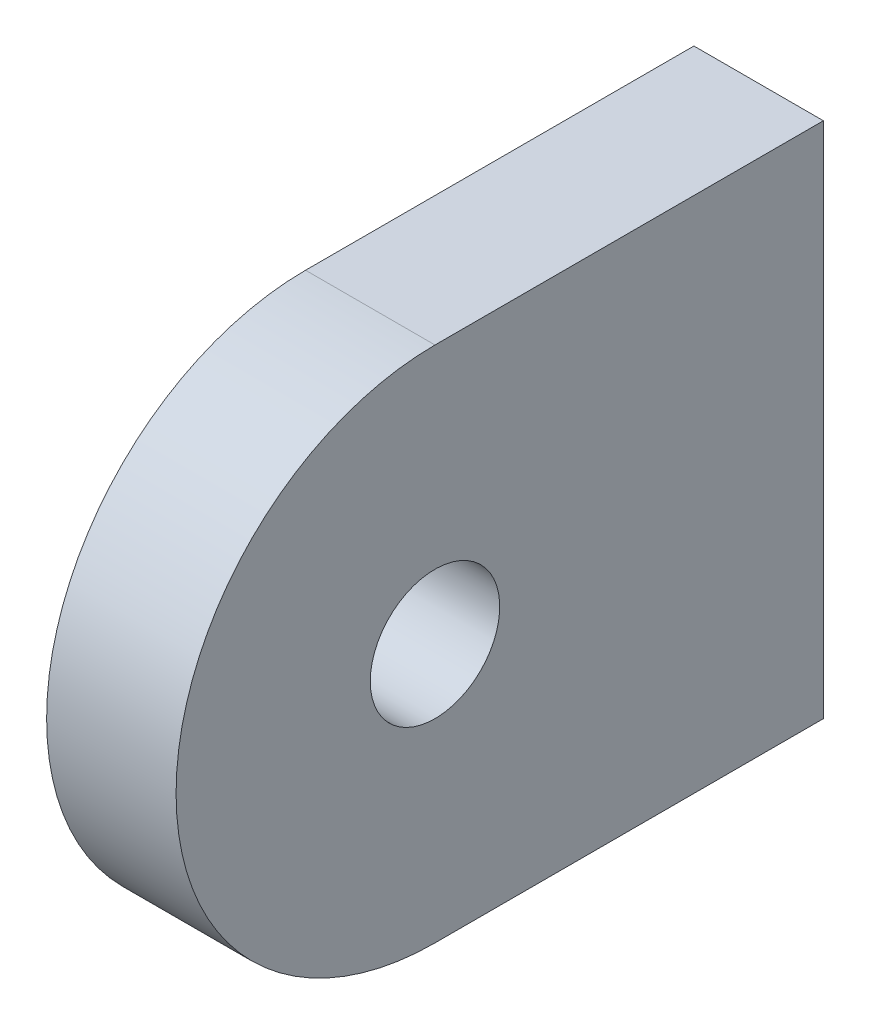
ISO-10303-21;
HEADER;
FILE_DESCRIPTION(('STEP AP214'),'2;1');
FILE_NAME('part.step','',(''),(''),'','','');
FILE_SCHEMA(('AUTOMOTIVE_DESIGN { 1 0 10303 214 1 1 1 1 }'));
ENDSEC;
DATA;
#1=APPLICATION_CONTEXT('core data for automotive mechanical design processes');
#2=APPLICATION_PROTOCOL_DEFINITION('international standard','automotive_design',2000,#1);
#3=PRODUCT_CONTEXT('',#1,'mechanical');
#4=PRODUCT('Part','Part','',(#3));
#5=PRODUCT_RELATED_PRODUCT_CATEGORY('part','',(#4));
#6=PRODUCT_DEFINITION_FORMATION('','',#4);
#7=PRODUCT_DEFINITION_CONTEXT('part definition',#1,'design');
#8=PRODUCT_DEFINITION('design','',#6,#7);
#9=PRODUCT_DEFINITION_SHAPE('','',#8);
#10=(LENGTH_UNIT() NAMED_UNIT(*) SI_UNIT(.MILLI.,.METRE.));
#11=(NAMED_UNIT(*) PLANE_ANGLE_UNIT() SI_UNIT($,.RADIAN.));
#12=(NAMED_UNIT(*) SI_UNIT($,.STERADIAN.) SOLID_ANGLE_UNIT());
#13=UNCERTAINTY_MEASURE_WITH_UNIT(LENGTH_MEASURE(1.E-05),#10,'distance_accuracy_value','');
#14=(GEOMETRIC_REPRESENTATION_CONTEXT(3) GLOBAL_UNCERTAINTY_ASSIGNED_CONTEXT((#13)) GLOBAL_UNIT_ASSIGNED_CONTEXT((#10,
#11,#12)) REPRESENTATION_CONTEXT('',''));
#15=CARTESIAN_POINT('',(0.,0.,0.));
#16=DIRECTION('',(0.,0.,1.));
#17=DIRECTION('',(1.,0.,0.));
#18=AXIS2_PLACEMENT_3D('',#15,#16,#17);
#19=CARTESIAN_POINT('',(-13.,-220.,175.));
#20=DIRECTION('',(-1.,0.,0.));
#21=DIRECTION('',(0.,0.,1.));
#22=AXIS2_PLACEMENT_3D('',#19,#20,#21);
#23=PLANE('',#22);
#24=CARTESIAN_POINT('',(-13.,-220.,175.));
#25=DIRECTION('',(-1.,0.,0.));
#26=DIRECTION('',(0.,0.,1.));
#27=AXIS2_PLACEMENT_3D('',#24,#25,#26);
#28=CIRCLE('',#27,20.);
#29=CARTESIAN_POINT('',(-13.,-240.,175.));
#30=VERTEX_POINT('',#29);
#31=CARTESIAN_POINT('',(-13.,-200.,175.));
#32=VERTEX_POINT('',#31);
#33=EDGE_CURVE('E93',#30,#32,#28,.T.);
#34=ORIENTED_EDGE('',*,*,#33,.T.);
#35=DIRECTION('',(0.,0.,-1.));
#36=VECTOR('',#35,1.);
#37=CARTESIAN_POINT('',(-13.,-200.,175.));
#38=LINE('',#37,#36);
#39=CARTESIAN_POINT('',(-13.,-200.,145.));
#40=VERTEX_POINT('',#39);
#41=EDGE_CURVE('E88',#32,#40,#38,.T.);
#42=ORIENTED_EDGE('',*,*,#41,.T.);
#43=DIRECTION('',(0.,-1.,0.));
#44=VECTOR('',#43,1.);
#45=CARTESIAN_POINT('',(-13.,-200.,145.));
#46=LINE('',#45,#44);
#47=CARTESIAN_POINT('',(-13.,-240.,145.));
#48=VERTEX_POINT('',#47);
#49=EDGE_CURVE('E91',#40,#48,#46,.T.);
#50=ORIENTED_EDGE('',*,*,#49,.T.);
#51=DIRECTION('',(0.,0.,1.));
#52=VECTOR('',#51,1.);
#53=CARTESIAN_POINT('',(-13.,-240.,145.));
#54=LINE('',#53,#52);
#55=EDGE_CURVE('E58',#48,#30,#54,.T.);
#56=ORIENTED_EDGE('',*,*,#55,.T.);
#57=EDGE_LOOP('',(#34,#42,#50,#56));
#58=FACE_BOUND('',#57,.T.);
#59=CARTESIAN_POINT('',(-13.,-220.,175.));
#60=DIRECTION('',(-1.,0.,0.));
#61=DIRECTION('',(0.,0.,1.));
#62=AXIS2_PLACEMENT_3D('',#59,#60,#61);
#63=CIRCLE('',#62,5.00000000000002);
#64=CARTESIAN_POINT('',(-13.,-220.,180.));
#65=VERTEX_POINT('',#64);
#66=EDGE_CURVE('E108',#65,#65,#63,.T.);
#67=ORIENTED_EDGE('',*,*,#66,.F.);
#68=EDGE_LOOP('',(#67));
#69=FACE_BOUND('',#68,.T.);
#70=ADVANCED_FACE('F41',(#58,#69),#23,.T.);
#71=CARTESIAN_POINT('',(-3.,-220.,175.));
#72=DIRECTION('',(-1.,0.,0.));
#73=DIRECTION('',(0.,0.,1.));
#74=AXIS2_PLACEMENT_3D('',#71,#72,#73);
#75=PLANE('',#74);
#76=CARTESIAN_POINT('',(-3.,-220.,175.));
#77=DIRECTION('',(-1.,0.,0.));
#78=DIRECTION('',(0.,0.,1.));
#79=AXIS2_PLACEMENT_3D('',#76,#77,#78);
#80=CIRCLE('',#79,20.);
#81=CARTESIAN_POINT('',(-3.,-240.,175.));
#82=VERTEX_POINT('',#81);
#83=CARTESIAN_POINT('',(-3.,-200.,175.));
#84=VERTEX_POINT('',#83);
#85=EDGE_CURVE('E105',#82,#84,#80,.T.);
#86=ORIENTED_EDGE('',*,*,#85,.F.);
#87=DIRECTION('',(0.,0.,1.));
#88=VECTOR('',#87,1.);
#89=CARTESIAN_POINT('',(-3.,-240.,145.));
#90=LINE('',#89,#88);
#91=CARTESIAN_POINT('',(-3.,-240.,145.));
#92=VERTEX_POINT('',#91);
#93=EDGE_CURVE('E81',#92,#82,#90,.T.);
#94=ORIENTED_EDGE('',*,*,#93,.F.);
#95=DIRECTION('',(0.,-1.,0.));
#96=VECTOR('',#95,1.);
#97=CARTESIAN_POINT('',(-3.,-200.,145.));
#98=LINE('',#97,#96);
#99=CARTESIAN_POINT('',(-3.,-200.,145.));
#100=VERTEX_POINT('',#99);
#101=EDGE_CURVE('E75',#100,#92,#98,.T.);
#102=ORIENTED_EDGE('',*,*,#101,.F.);
#103=DIRECTION('',(0.,0.,-1.));
#104=VECTOR('',#103,1.);
#105=CARTESIAN_POINT('',(-3.,-200.,175.));
#106=LINE('',#105,#104);
#107=EDGE_CURVE('E97',#84,#100,#106,.T.);
#108=ORIENTED_EDGE('',*,*,#107,.F.);
#109=EDGE_LOOP('',(#86,#94,#102,#108));
#110=FACE_BOUND('',#109,.T.);
#111=CARTESIAN_POINT('',(-3.,-220.,175.));
#112=DIRECTION('',(-1.,0.,0.));
#113=DIRECTION('',(0.,0.,1.));
#114=AXIS2_PLACEMENT_3D('',#111,#112,#113);
#115=CIRCLE('',#114,5.00000000000002);
#116=CARTESIAN_POINT('',(-3.,-220.,180.));
#117=VERTEX_POINT('',#116);
#118=EDGE_CURVE('E120',#117,#117,#115,.T.);
#119=ORIENTED_EDGE('',*,*,#118,.T.);
#120=EDGE_LOOP('',(#119));
#121=FACE_BOUND('',#120,.T.);
#122=ADVANCED_FACE('F116',(#110,#121),#75,.F.);
#123=CARTESIAN_POINT('',(-13.,-220.,175.));
#124=DIRECTION('',(1.,0.,0.));
#125=DIRECTION('',(0.,0.,-1.));
#126=AXIS2_PLACEMENT_3D('',#123,#124,#125);
#127=CYLINDRICAL_SURFACE('',#126,20.);
#128=ORIENTED_EDGE('',*,*,#85,.T.);
#129=DIRECTION('',(1.,0.,0.));
#130=VECTOR('',#129,1.);
#131=CARTESIAN_POINT('',(-13.,-200.,175.));
#132=LINE('',#131,#130);
#133=EDGE_CURVE('E11',#32,#84,#132,.T.);
#134=ORIENTED_EDGE('',*,*,#133,.F.);
#135=ORIENTED_EDGE('',*,*,#33,.F.);
#136=DIRECTION('',(1.,0.,0.));
#137=VECTOR('',#136,1.);
#138=CARTESIAN_POINT('',(-13.,-240.,175.));
#139=LINE('',#138,#137);
#140=EDGE_CURVE('E101',#30,#82,#139,.T.);
#141=ORIENTED_EDGE('',*,*,#140,.T.);
#142=EDGE_LOOP('',(#128,#134,#135,#141));
#143=FACE_BOUND('',#142,.T.);
#144=ADVANCED_FACE('F43',(#143),#127,.T.);
#145=CARTESIAN_POINT('',(-13.,-200.,175.));
#146=DIRECTION('',(0.,-1.,0.));
#147=DIRECTION('',(0.,0.,-1.));
#148=AXIS2_PLACEMENT_3D('',#145,#146,#147);
#149=PLANE('',#148);
#150=ORIENTED_EDGE('',*,*,#107,.T.);
#151=DIRECTION('',(1.,0.,0.));
#152=VECTOR('',#151,1.);
#153=CARTESIAN_POINT('',(-13.,-200.,145.));
#154=LINE('',#153,#152);
#155=EDGE_CURVE('E50',#40,#100,#154,.T.);
#156=ORIENTED_EDGE('',*,*,#155,.F.);
#157=ORIENTED_EDGE('',*,*,#41,.F.);
#158=ORIENTED_EDGE('',*,*,#133,.T.);
#159=EDGE_LOOP('',(#150,#156,#157,#158));
#160=FACE_BOUND('',#159,.T.);
#161=ADVANCED_FACE('F96',(#160),#149,.F.);
#162=CARTESIAN_POINT('',(-13.,-200.,145.));
#163=DIRECTION('',(0.,0.,1.));
#164=DIRECTION('',(1.,0.,0.));
#165=AXIS2_PLACEMENT_3D('',#162,#163,#164);
#166=PLANE('',#165);
#167=ORIENTED_EDGE('',*,*,#101,.T.);
#168=DIRECTION('',(1.,0.,0.));
#169=VECTOR('',#168,1.);
#170=CARTESIAN_POINT('',(-13.,-240.,145.));
#171=LINE('',#170,#169);
#172=EDGE_CURVE('E98',#48,#92,#171,.T.);
#173=ORIENTED_EDGE('',*,*,#172,.F.);
#174=ORIENTED_EDGE('',*,*,#49,.F.);
#175=ORIENTED_EDGE('',*,*,#155,.T.);
#176=EDGE_LOOP('',(#167,#173,#174,#175));
#177=FACE_BOUND('',#176,.T.);
#178=ADVANCED_FACE('F99',(#177),#166,.F.);
#179=CARTESIAN_POINT('',(-13.,-240.,145.));
#180=DIRECTION('',(0.,1.,0.));
#181=DIRECTION('',(0.,0.,1.));
#182=AXIS2_PLACEMENT_3D('',#179,#180,#181);
#183=PLANE('',#182);
#184=ORIENTED_EDGE('',*,*,#93,.T.);
#185=ORIENTED_EDGE('',*,*,#140,.F.);
#186=ORIENTED_EDGE('',*,*,#55,.F.);
#187=ORIENTED_EDGE('',*,*,#172,.T.);
#188=EDGE_LOOP('',(#184,#185,#186,#187));
#189=FACE_BOUND('',#188,.T.);
#190=ADVANCED_FACE('F113',(#189),#183,.F.);
#191=CARTESIAN_POINT('',(-13.,-220.,175.));
#192=DIRECTION('',(1.,0.,0.));
#193=DIRECTION('',(0.,0.,-1.));
#194=AXIS2_PLACEMENT_3D('',#191,#192,#193);
#195=CYLINDRICAL_SURFACE('',#194,5.00000000000002);
#196=ORIENTED_EDGE('',*,*,#66,.T.);
#197=EDGE_LOOP('',(#196));
#198=FACE_BOUND('',#197,.T.);
#199=ORIENTED_EDGE('',*,*,#118,.F.);
#200=EDGE_LOOP('',(#199));
#201=FACE_BOUND('',#200,.T.);
#202=ADVANCED_FACE('F126',(#198,#201),#195,.F.);
#203=CLOSED_SHELL('',(#70,#122,#144,#161,#178,#190,#202));
#204=MANIFOLD_SOLID_BREP('B2',#203);
#205=ADVANCED_BREP_SHAPE_REPRESENTATION('',(#18,#204),#14);
#206=SHAPE_DEFINITION_REPRESENTATION(#9,#205);
ENDSEC;
END-ISO-10303-21;
